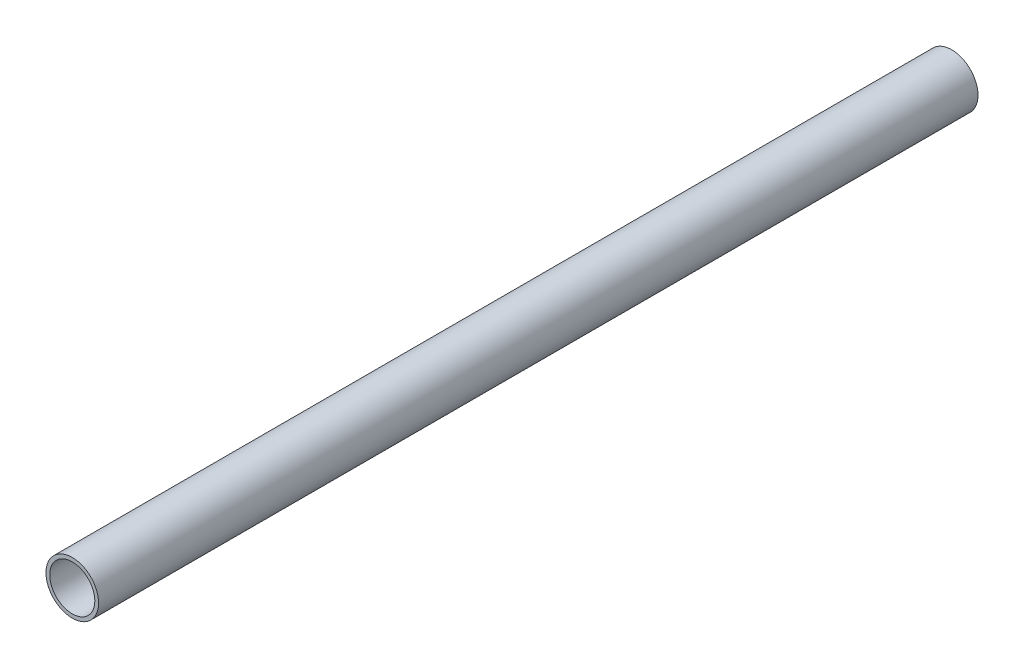
ISO-10303-21;
HEADER;
FILE_DESCRIPTION(('STEP AP214'),'2;1');
FILE_NAME('part.step','',(''),(''),'','','');
FILE_SCHEMA(('AUTOMOTIVE_DESIGN { 1 0 10303 214 1 1 1 1 }'));
ENDSEC;
DATA;
#1=APPLICATION_CONTEXT('core data for automotive mechanical design processes');
#2=APPLICATION_PROTOCOL_DEFINITION('international standard','automotive_design',2000,#1);
#3=PRODUCT_CONTEXT('',#1,'mechanical');
#4=PRODUCT('Part','Part','',(#3));
#5=PRODUCT_RELATED_PRODUCT_CATEGORY('part','',(#4));
#6=PRODUCT_DEFINITION_FORMATION('','',#4);
#7=PRODUCT_DEFINITION_CONTEXT('part definition',#1,'design');
#8=PRODUCT_DEFINITION('design','',#6,#7);
#9=PRODUCT_DEFINITION_SHAPE('','',#8);
#10=(LENGTH_UNIT() NAMED_UNIT(*) SI_UNIT(.MILLI.,.METRE.));
#11=(NAMED_UNIT(*) PLANE_ANGLE_UNIT() SI_UNIT($,.RADIAN.));
#12=(NAMED_UNIT(*) SI_UNIT($,.STERADIAN.) SOLID_ANGLE_UNIT());
#13=UNCERTAINTY_MEASURE_WITH_UNIT(LENGTH_MEASURE(1.E-05),#10,'distance_accuracy_value','');
#14=(GEOMETRIC_REPRESENTATION_CONTEXT(3) GLOBAL_UNCERTAINTY_ASSIGNED_CONTEXT((#13)) GLOBAL_UNIT_ASSIGNED_CONTEXT((#10,
#11,#12)) REPRESENTATION_CONTEXT('',''));
#15=CARTESIAN_POINT('',(0.,0.,0.));
#16=DIRECTION('',(0.,0.,1.));
#17=DIRECTION('',(1.,0.,0.));
#18=AXIS2_PLACEMENT_3D('',#15,#16,#17);
#19=CARTESIAN_POINT('',(0.,0.,234.));
#20=DIRECTION('',(0.,0.,1.));
#21=DIRECTION('',(1.,0.,0.));
#22=AXIS2_PLACEMENT_3D('',#19,#20,#21);
#23=PLANE('',#22);
#24=CARTESIAN_POINT('',(0.,0.,234.));
#25=DIRECTION('',(0.,0.,1.));
#26=DIRECTION('',(1.,0.,0.));
#27=AXIS2_PLACEMENT_3D('',#24,#25,#26);
#28=CIRCLE('',#27,7.);
#29=CARTESIAN_POINT('',(7.,0.,234.));
#30=VERTEX_POINT('',#29);
#31=EDGE_CURVE('E11',#30,#30,#28,.T.);
#32=ORIENTED_EDGE('',*,*,#31,.T.);
#33=EDGE_LOOP('',(#32));
#34=FACE_BOUND('',#33,.T.);
#35=CARTESIAN_POINT('',(0.,0.,234.));
#36=DIRECTION('',(0.,0.,1.));
#37=DIRECTION('',(1.,0.,0.));
#38=AXIS2_PLACEMENT_3D('',#35,#36,#37);
#39=CIRCLE('',#38,6.);
#40=CARTESIAN_POINT('',(6.,0.,234.));
#41=VERTEX_POINT('',#40);
#42=EDGE_CURVE('E54',#41,#41,#39,.T.);
#43=ORIENTED_EDGE('',*,*,#42,.F.);
#44=EDGE_LOOP('',(#43));
#45=FACE_BOUND('',#44,.T.);
#46=ADVANCED_FACE('F43',(#34,#45),#23,.T.);
#47=CARTESIAN_POINT('',(0.,0.,0.));
#48=DIRECTION('',(0.,0.,1.));
#49=DIRECTION('',(1.,0.,0.));
#50=AXIS2_PLACEMENT_3D('',#47,#48,#49);
#51=PLANE('',#50);
#52=CARTESIAN_POINT('',(0.,0.,0.));
#53=DIRECTION('',(0.,0.,1.));
#54=DIRECTION('',(1.,0.,0.));
#55=AXIS2_PLACEMENT_3D('',#52,#53,#54);
#56=CIRCLE('',#55,7.);
#57=CARTESIAN_POINT('',(7.,0.,0.));
#58=VERTEX_POINT('',#57);
#59=EDGE_CURVE('E47',#58,#58,#56,.T.);
#60=ORIENTED_EDGE('',*,*,#59,.F.);
#61=EDGE_LOOP('',(#60));
#62=FACE_BOUND('',#61,.T.);
#63=CARTESIAN_POINT('',(0.,0.,0.));
#64=DIRECTION('',(0.,0.,1.));
#65=DIRECTION('',(1.,0.,0.));
#66=AXIS2_PLACEMENT_3D('',#63,#64,#65);
#67=CIRCLE('',#66,6.);
#68=CARTESIAN_POINT('',(6.,0.,0.));
#69=VERTEX_POINT('',#68);
#70=EDGE_CURVE('E56',#69,#69,#67,.T.);
#71=ORIENTED_EDGE('',*,*,#70,.T.);
#72=EDGE_LOOP('',(#71));
#73=FACE_BOUND('',#72,.T.);
#74=ADVANCED_FACE('F66',(#62,#73),#51,.F.);
#75=CARTESIAN_POINT('',(0.,0.,234.));
#76=DIRECTION('',(0.,0.,-1.));
#77=DIRECTION('',(-1.,0.,0.));
#78=AXIS2_PLACEMENT_3D('',#75,#76,#77);
#79=CYLINDRICAL_SURFACE('',#78,7.);
#80=ORIENTED_EDGE('',*,*,#31,.F.);
#81=EDGE_LOOP('',(#80));
#82=FACE_BOUND('',#81,.T.);
#83=ORIENTED_EDGE('',*,*,#59,.T.);
#84=EDGE_LOOP('',(#83));
#85=FACE_BOUND('',#84,.T.);
#86=ADVANCED_FACE('F45',(#82,#85),#79,.T.);
#87=CARTESIAN_POINT('',(0.,0.,234.));
#88=DIRECTION('',(0.,0.,-1.));
#89=DIRECTION('',(-1.,0.,0.));
#90=AXIS2_PLACEMENT_3D('',#87,#88,#89);
#91=CYLINDRICAL_SURFACE('',#90,6.);
#92=ORIENTED_EDGE('',*,*,#42,.T.);
#93=EDGE_LOOP('',(#92));
#94=FACE_BOUND('',#93,.T.);
#95=ORIENTED_EDGE('',*,*,#70,.F.);
#96=EDGE_LOOP('',(#95));
#97=FACE_BOUND('',#96,.T.);
#98=ADVANCED_FACE('F62',(#94,#97),#91,.F.);
#99=CLOSED_SHELL('',(#46,#74,#86,#98));
#100=MANIFOLD_SOLID_BREP('B2',#99);
#101=ADVANCED_BREP_SHAPE_REPRESENTATION('',(#18,#100),#14);
#102=SHAPE_DEFINITION_REPRESENTATION(#9,#101);
ENDSEC;
END-ISO-10303-21;
